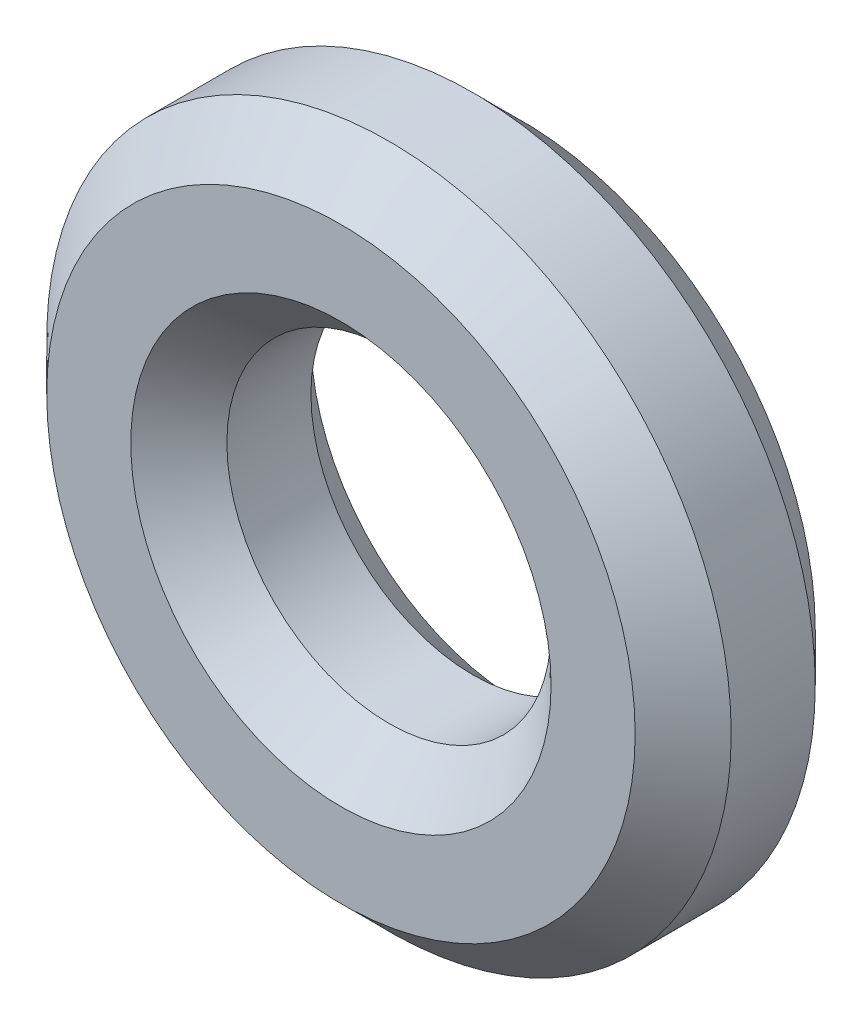
ISO-10303-21;
HEADER;
FILE_DESCRIPTION(('STEP AP214'),'2;1');
FILE_NAME('part.step','',(''),(''),'','','');
FILE_SCHEMA(('AUTOMOTIVE_DESIGN { 1 0 10303 214 1 1 1 1 }'));
ENDSEC;
DATA;
#1=APPLICATION_CONTEXT('core data for automotive mechanical design processes');
#2=APPLICATION_PROTOCOL_DEFINITION('international standard','automotive_design',2000,#1);
#3=PRODUCT_CONTEXT('',#1,'mechanical');
#4=PRODUCT('Part','Part','',(#3));
#5=PRODUCT_RELATED_PRODUCT_CATEGORY('part','',(#4));
#6=PRODUCT_DEFINITION_FORMATION('','',#4);
#7=PRODUCT_DEFINITION_CONTEXT('part definition',#1,'design');
#8=PRODUCT_DEFINITION('design','',#6,#7);
#9=PRODUCT_DEFINITION_SHAPE('','',#8);
#10=(LENGTH_UNIT() NAMED_UNIT(*) SI_UNIT(.MILLI.,.METRE.));
#11=(NAMED_UNIT(*) PLANE_ANGLE_UNIT() SI_UNIT($,.RADIAN.));
#12=(NAMED_UNIT(*) SI_UNIT($,.STERADIAN.) SOLID_ANGLE_UNIT());
#13=UNCERTAINTY_MEASURE_WITH_UNIT(LENGTH_MEASURE(1.E-05),#10,'distance_accuracy_value','');
#14=(GEOMETRIC_REPRESENTATION_CONTEXT(3) GLOBAL_UNCERTAINTY_ASSIGNED_CONTEXT((#13)) GLOBAL_UNIT_ASSIGNED_CONTEXT((#10,
#11,#12)) REPRESENTATION_CONTEXT('',''));
#15=CARTESIAN_POINT('',(0.,0.,0.));
#16=DIRECTION('',(0.,0.,1.));
#17=DIRECTION('',(1.,0.,0.));
#18=AXIS2_PLACEMENT_3D('',#15,#16,#17);
#19=CARTESIAN_POINT('',(0.,0.,3.));
#20=DIRECTION('',(0.,0.,1.));
#21=DIRECTION('',(1.,0.,0.));
#22=AXIS2_PLACEMENT_3D('',#19,#20,#21);
#23=PLANE('',#22);
#24=CARTESIAN_POINT('',(0.,0.,3.));
#25=DIRECTION('',(0.,0.,1.));
#26=DIRECTION('',(1.,0.,0.));
#27=AXIS2_PLACEMENT_3D('',#24,#25,#26);
#28=CIRCLE('',#27,3.5);
#29=CARTESIAN_POINT('',(3.5,0.,3.));
#30=VERTEX_POINT('',#29);
#31=EDGE_CURVE('E10',#30,#30,#28,.F.);
#32=ORIENTED_EDGE('',*,*,#31,.T.);
#33=EDGE_LOOP('',(#32));
#34=FACE_BOUND('',#33,.T.);
#35=CARTESIAN_POINT('',(0.,0.,3.));
#36=DIRECTION('',(0.,0.,1.));
#37=DIRECTION('',(1.,0.,0.));
#38=AXIS2_PLACEMENT_3D('',#35,#36,#37);
#39=CIRCLE('',#38,4.9);
#40=CARTESIAN_POINT('',(4.9,0.,3.));
#41=VERTEX_POINT('',#40);
#42=EDGE_CURVE('E39',#41,#41,#39,.T.);
#43=ORIENTED_EDGE('',*,*,#42,.T.);
#44=EDGE_LOOP('',(#43));
#45=FACE_BOUND('',#44,.T.);
#46=ADVANCED_FACE('F32',(#34,#45),#23,.T.);
#47=CARTESIAN_POINT('',(0.,0.,0.));
#48=DIRECTION('',(0.,0.,1.));
#49=DIRECTION('',(1.,0.,0.));
#50=AXIS2_PLACEMENT_3D('',#47,#48,#49);
#51=PLANE('',#50);
#52=CARTESIAN_POINT('',(0.,0.,0.));
#53=DIRECTION('',(0.,0.,1.));
#54=DIRECTION('',(1.,0.,0.));
#55=AXIS2_PLACEMENT_3D('',#52,#53,#54);
#56=CIRCLE('',#55,3.5);
#57=CARTESIAN_POINT('',(3.5,0.,0.));
#58=VERTEX_POINT('',#57);
#59=EDGE_CURVE('E58',#58,#58,#56,.T.);
#60=ORIENTED_EDGE('',*,*,#59,.T.);
#61=EDGE_LOOP('',(#60));
#62=FACE_BOUND('',#61,.T.);
#63=CARTESIAN_POINT('',(0.,0.,0.));
#64=DIRECTION('',(0.,0.,1.));
#65=DIRECTION('',(1.,0.,0.));
#66=AXIS2_PLACEMENT_3D('',#63,#64,#65);
#67=CIRCLE('',#66,4.9);
#68=CARTESIAN_POINT('',(4.9,0.,0.));
#69=VERTEX_POINT('',#68);
#70=EDGE_CURVE('E61',#69,#69,#67,.F.);
#71=ORIENTED_EDGE('',*,*,#70,.T.);
#72=EDGE_LOOP('',(#71));
#73=FACE_BOUND('',#72,.T.);
#74=ADVANCED_FACE('F65',(#62,#73),#51,.F.);
#75=CARTESIAN_POINT('',(0.,0.,3.));
#76=DIRECTION('',(0.,0.,-1.));
#77=DIRECTION('',(-1.,0.,0.));
#78=AXIS2_PLACEMENT_3D('',#75,#76,#77);
#79=CYLINDRICAL_SURFACE('',#78,5.7);
#80=CARTESIAN_POINT('',(0.,0.,0.800000000000002));
#81=DIRECTION('',(0.,0.,1.));
#82=DIRECTION('',(1.,0.,0.));
#83=AXIS2_PLACEMENT_3D('',#80,#81,#82);
#84=CIRCLE('',#83,5.7);
#85=CARTESIAN_POINT('',(5.7,0.,0.800000000000002));
#86=VERTEX_POINT('',#85);
#87=EDGE_CURVE('E43',#86,#86,#84,.T.);
#88=ORIENTED_EDGE('',*,*,#87,.T.);
#89=EDGE_LOOP('',(#88));
#90=FACE_BOUND('',#89,.T.);
#91=CARTESIAN_POINT('',(0.,0.,2.2));
#92=DIRECTION('',(0.,0.,1.));
#93=DIRECTION('',(1.,0.,0.));
#94=AXIS2_PLACEMENT_3D('',#91,#92,#93);
#95=CIRCLE('',#94,5.7);
#96=CARTESIAN_POINT('',(5.7,0.,2.2));
#97=VERTEX_POINT('',#96);
#98=EDGE_CURVE('E47',#97,#97,#95,.F.);
#99=ORIENTED_EDGE('',*,*,#98,.T.);
#100=EDGE_LOOP('',(#99));
#101=FACE_BOUND('',#100,.T.);
#102=ADVANCED_FACE('F75',(#90,#101),#79,.T.);
#103=CARTESIAN_POINT('',(0.,0.,3.));
#104=DIRECTION('',(0.,0.,-1.));
#105=DIRECTION('',(-1.,0.,0.));
#106=AXIS2_PLACEMENT_3D('',#103,#104,#105);
#107=CYLINDRICAL_SURFACE('',#106,2.7);
#108=CARTESIAN_POINT('',(0.,0.,0.800000000000003));
#109=DIRECTION('',(0.,0.,1.));
#110=DIRECTION('',(1.,0.,0.));
#111=AXIS2_PLACEMENT_3D('',#108,#109,#110);
#112=CIRCLE('',#111,2.7);
#113=CARTESIAN_POINT('',(2.7,0.,0.800000000000003));
#114=VERTEX_POINT('',#113);
#115=EDGE_CURVE('E52',#114,#114,#112,.F.);
#116=ORIENTED_EDGE('',*,*,#115,.T.);
#117=EDGE_LOOP('',(#116));
#118=FACE_BOUND('',#117,.T.);
#119=CARTESIAN_POINT('',(0.,0.,2.2));
#120=DIRECTION('',(0.,0.,1.));
#121=DIRECTION('',(1.,0.,0.));
#122=AXIS2_PLACEMENT_3D('',#119,#120,#121);
#123=CIRCLE('',#122,2.7);
#124=CARTESIAN_POINT('',(2.7,0.,2.2));
#125=VERTEX_POINT('',#124);
#126=EDGE_CURVE('E55',#125,#125,#123,.T.);
#127=ORIENTED_EDGE('',*,*,#126,.T.);
#128=EDGE_LOOP('',(#127));
#129=FACE_BOUND('',#128,.T.);
#130=ADVANCED_FACE('F78',(#118,#129),#107,.F.);
#131=CARTESIAN_POINT('',(0.,0.,0.));
#132=DIRECTION('',(0.,0.,-1.));
#133=DIRECTION('',(-1.,0.,0.));
#134=AXIS2_PLACEMENT_3D('',#131,#132,#133);
#135=CONICAL_SURFACE('',#134,3.5,0.785398163397447);
#136=ORIENTED_EDGE('',*,*,#115,.F.);
#137=EDGE_LOOP('',(#136));
#138=FACE_BOUND('',#137,.T.);
#139=ORIENTED_EDGE('',*,*,#59,.F.);
#140=EDGE_LOOP('',(#139));
#141=FACE_BOUND('',#140,.T.);
#142=ADVANCED_FACE('F71',(#138,#141),#135,.F.);
#143=CARTESIAN_POINT('',(0.,0.,0.800000000000002));
#144=DIRECTION('',(0.,0.,1.));
#145=DIRECTION('',(1.,0.,0.));
#146=AXIS2_PLACEMENT_3D('',#143,#144,#145);
#147=CONICAL_SURFACE('',#146,5.7,0.785398163397449);
#148=ORIENTED_EDGE('',*,*,#70,.F.);
#149=EDGE_LOOP('',(#148));
#150=FACE_BOUND('',#149,.T.);
#151=ORIENTED_EDGE('',*,*,#87,.F.);
#152=EDGE_LOOP('',(#151));
#153=FACE_BOUND('',#152,.T.);
#154=ADVANCED_FACE('F67',(#150,#153),#147,.T.);
#155=CARTESIAN_POINT('',(0.,0.,2.2));
#156=DIRECTION('',(0.,0.,1.));
#157=DIRECTION('',(1.,0.,0.));
#158=AXIS2_PLACEMENT_3D('',#155,#156,#157);
#159=CONICAL_SURFACE('',#158,2.7,0.785398163397449);
#160=CARTESIAN_POINT('',(3.5,0.,3.));
#161=CARTESIAN_POINT('',(3.49166666666667,0.,2.99166666666667));
#162=CARTESIAN_POINT('',(3.48333333333333,0.,2.98333333333333));
#163=CARTESIAN_POINT('',(3.46666666666667,0.,2.96666666666667));
#164=CARTESIAN_POINT('',(3.45833333333333,0.,2.95833333333333));
#165=CARTESIAN_POINT('',(3.44166666666667,0.,2.94166666666667));
#166=CARTESIAN_POINT('',(3.43333333333333,0.,2.93333333333333));
#167=CARTESIAN_POINT('',(3.41666666666667,0.,2.91666666666667));
#168=CARTESIAN_POINT('',(3.40833333333333,0.,2.90833333333333));
#169=CARTESIAN_POINT('',(3.39166666666667,0.,2.89166666666667));
#170=CARTESIAN_POINT('',(3.38333333333333,0.,2.88333333333333));
#171=CARTESIAN_POINT('',(3.36666666666667,0.,2.86666666666667));
#172=CARTESIAN_POINT('',(3.35833333333333,0.,2.85833333333333));
#173=CARTESIAN_POINT('',(3.34166666666667,0.,2.84166666666667));
#174=CARTESIAN_POINT('',(3.33333333333333,0.,2.83333333333333));
#175=CARTESIAN_POINT('',(3.31666666666667,0.,2.81666666666667));
#176=CARTESIAN_POINT('',(3.30833333333333,0.,2.80833333333333));
#177=CARTESIAN_POINT('',(3.29166666666667,0.,2.79166666666667));
#178=CARTESIAN_POINT('',(3.28333333333333,0.,2.78333333333333));
#179=CARTESIAN_POINT('',(3.26666666666667,0.,2.76666666666667));
#180=CARTESIAN_POINT('',(3.25833333333333,0.,2.75833333333333));
#181=CARTESIAN_POINT('',(3.24166666666667,0.,2.74166666666667));
#182=CARTESIAN_POINT('',(3.23333333333333,0.,2.73333333333333));
#183=CARTESIAN_POINT('',(3.21666666666667,0.,2.71666666666667));
#184=CARTESIAN_POINT('',(3.20833333333333,0.,2.70833333333333));
#185=CARTESIAN_POINT('',(3.19166666666667,0.,2.69166666666667));
#186=CARTESIAN_POINT('',(3.18333333333333,0.,2.68333333333333));
#187=CARTESIAN_POINT('',(3.16666666666667,0.,2.66666666666667));
#188=CARTESIAN_POINT('',(3.15833333333333,0.,2.65833333333333));
#189=CARTESIAN_POINT('',(3.14166666666667,0.,2.64166666666667));
#190=CARTESIAN_POINT('',(3.13333333333333,0.,2.63333333333333));
#191=CARTESIAN_POINT('',(3.11666666666667,0.,2.61666666666667));
#192=CARTESIAN_POINT('',(3.10833333333333,0.,2.60833333333333));
#193=CARTESIAN_POINT('',(3.09166666666667,0.,2.59166666666667));
#194=CARTESIAN_POINT('',(3.08333333333333,0.,2.58333333333333));
#195=CARTESIAN_POINT('',(3.06666666666667,0.,2.56666666666667));
#196=CARTESIAN_POINT('',(3.05833333333333,0.,2.55833333333333));
#197=CARTESIAN_POINT('',(3.04166666666667,0.,2.54166666666667));
#198=CARTESIAN_POINT('',(3.03333333333333,0.,2.53333333333333));
#199=CARTESIAN_POINT('',(3.01666666666667,0.,2.51666666666667));
#200=CARTESIAN_POINT('',(3.00833333333333,0.,2.50833333333333));
#201=CARTESIAN_POINT('',(2.99166666666667,0.,2.49166666666667));
#202=CARTESIAN_POINT('',(2.98333333333333,0.,2.48333333333333));
#203=CARTESIAN_POINT('',(2.96666666666667,0.,2.46666666666667));
#204=CARTESIAN_POINT('',(2.95833333333333,0.,2.45833333333333));
#205=CARTESIAN_POINT('',(2.94166666666667,0.,2.44166666666667));
#206=CARTESIAN_POINT('',(2.93333333333333,0.,2.43333333333333));
#207=CARTESIAN_POINT('',(2.91666666666667,0.,2.41666666666667));
#208=CARTESIAN_POINT('',(2.90833333333333,0.,2.40833333333333));
#209=CARTESIAN_POINT('',(2.89166666666667,0.,2.39166666666667));
#210=CARTESIAN_POINT('',(2.88333333333333,0.,2.38333333333333));
#211=CARTESIAN_POINT('',(2.86666666666667,0.,2.36666666666667));
#212=CARTESIAN_POINT('',(2.85833333333333,0.,2.35833333333333));
#213=CARTESIAN_POINT('',(2.84166666666667,0.,2.34166666666667));
#214=CARTESIAN_POINT('',(2.83333333333333,0.,2.33333333333333));
#215=CARTESIAN_POINT('',(2.81666666666667,0.,2.31666666666667));
#216=CARTESIAN_POINT('',(2.80833333333333,0.,2.30833333333333));
#217=CARTESIAN_POINT('',(2.79166666666667,0.,2.29166666666667));
#218=CARTESIAN_POINT('',(2.78333333333333,0.,2.28333333333333));
#219=CARTESIAN_POINT('',(2.76666666666667,0.,2.26666666666667));
#220=CARTESIAN_POINT('',(2.75833333333333,0.,2.25833333333333));
#221=CARTESIAN_POINT('',(2.74166666666667,0.,2.24166666666667));
#222=CARTESIAN_POINT('',(2.73333333333333,0.,2.23333333333334));
#223=CARTESIAN_POINT('',(2.71666666666667,0.,2.21666666666667));
#224=CARTESIAN_POINT('',(2.70833333333333,0.,2.20833333333334));
#225=CARTESIAN_POINT('',(2.7,0.,2.2));
#226=B_SPLINE_CURVE_WITH_KNOTS('',3,(#160,#161,#162,#163,#164,#165,#166,#167,#168,#169,#170,
#171,#172,#173,#174,#175,#176,#177,#178,#179,#180,#181,#182,#183,#184,#185,#186,#187,#188,#189,
#190,#191,#192,#193,#194,#195,#196,#197,#198,#199,#200,#201,#202,#203,#204,#205,#206,#207,#208,
#209,#210,#211,#212,#213,#214,#215,#216,#217,#218,#219,#220,#221,#222,#223,#224,#225),
.UNSPECIFIED.,.F.,.F.,(4,2,2,2,2,2,2,2,2,2,2,2,2,2,2,2,2,2,2,2,2,2,2,2,2,2,2,2,2,2,2,2,4),(0.,
0.0353553390593272,0.0707106781186543,0.106066017177982,0.141421356237309,0.176776695296636,
0.212132034355964,0.247487373415291,0.282842712474618,0.318198051533946,0.353553390593273,
0.3889087296526,0.424264068711927,0.459619407771255,0.494974746830582,0.53033008588991,
0.565685424949237,0.601040764008564,0.636396103067892,0.671751442127219,0.707106781186546,
0.742462120245874,0.777817459305201,0.813172798364528,0.848528137423856,0.883883476483183,
0.91923881554251,0.954594154601838,0.989949493661165,1.02530483272049,1.06066017177982,
1.09601551083915,1.13137084989847),.UNSPECIFIED.);
#227=EDGE_CURVE('BSEAM70',#30,#125,#226,.T.);
#228=ORIENTED_EDGE('',*,*,#31,.F.);
#229=ORIENTED_EDGE('',*,*,#126,.F.);
#230=ORIENTED_EDGE('',*,*,#227,.T.);
#231=ORIENTED_EDGE('',*,*,#227,.F.);
#232=EDGE_LOOP('',(#228,#230,#229,#231));
#233=FACE_BOUND('',#232,.T.);
#234=ADVANCED_FACE('F70',(#233),#159,.F.);
#235=CARTESIAN_POINT('',(0.,0.,3.));
#236=DIRECTION('',(0.,0.,-1.));
#237=DIRECTION('',(-1.,0.,0.));
#238=AXIS2_PLACEMENT_3D('',#235,#236,#237);
#239=CONICAL_SURFACE('',#238,4.9,0.785398163397445);
#240=ORIENTED_EDGE('',*,*,#98,.F.);
#241=EDGE_LOOP('',(#240));
#242=FACE_BOUND('',#241,.T.);
#243=ORIENTED_EDGE('',*,*,#42,.F.);
#244=EDGE_LOOP('',(#243));
#245=FACE_BOUND('',#244,.T.);
#246=ADVANCED_FACE('F34',(#242,#245),#239,.T.);
#247=CLOSED_SHELL('',(#46,#74,#102,#130,#142,#154,#234,#246));
#248=MANIFOLD_SOLID_BREP('B2',#247);
#249=ADVANCED_BREP_SHAPE_REPRESENTATION('',(#18,#248),#14);
#250=SHAPE_DEFINITION_REPRESENTATION(#9,#249);
ENDSEC;
END-ISO-10303-21;
